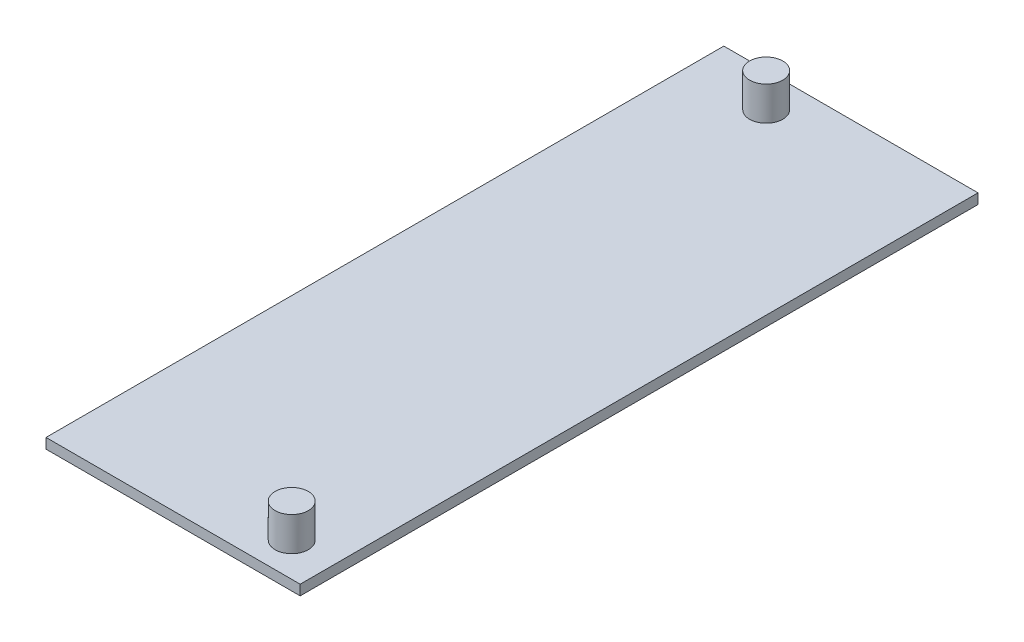
ISO-10303-21;
HEADER;
FILE_DESCRIPTION(('STEP AP214'),'2;1');
FILE_NAME('part.step','',(''),(''),'','','');
FILE_SCHEMA(('AUTOMOTIVE_DESIGN { 1 0 10303 214 1 1 1 1 }'));
ENDSEC;
DATA;
#1=APPLICATION_CONTEXT('core data for automotive mechanical design processes');
#2=APPLICATION_PROTOCOL_DEFINITION('international standard','automotive_design',2000,#1);
#3=PRODUCT_CONTEXT('',#1,'mechanical');
#4=PRODUCT('Part','Part','',(#3));
#5=PRODUCT_RELATED_PRODUCT_CATEGORY('part','',(#4));
#6=PRODUCT_DEFINITION_FORMATION('','',#4);
#7=PRODUCT_DEFINITION_CONTEXT('part definition',#1,'design');
#8=PRODUCT_DEFINITION('design','',#6,#7);
#9=PRODUCT_DEFINITION_SHAPE('','',#8);
#10=(LENGTH_UNIT() NAMED_UNIT(*) SI_UNIT(.MILLI.,.METRE.));
#11=(NAMED_UNIT(*) PLANE_ANGLE_UNIT() SI_UNIT($,.RADIAN.));
#12=(NAMED_UNIT(*) SI_UNIT($,.STERADIAN.) SOLID_ANGLE_UNIT());
#13=UNCERTAINTY_MEASURE_WITH_UNIT(LENGTH_MEASURE(1.E-05),#10,'distance_accuracy_value','');
#14=(GEOMETRIC_REPRESENTATION_CONTEXT(3) GLOBAL_UNCERTAINTY_ASSIGNED_CONTEXT((#13)) GLOBAL_UNIT_ASSIGNED_CONTEXT((#10,
#11,#12)) REPRESENTATION_CONTEXT('',''));
#15=CARTESIAN_POINT('',(0.,0.,0.));
#16=DIRECTION('',(0.,0.,1.));
#17=DIRECTION('',(1.,0.,0.));
#18=AXIS2_PLACEMENT_3D('',#15,#16,#17);
#19=CARTESIAN_POINT('',(0.,0.,200.));
#20=DIRECTION('',(1.,0.,0.));
#21=DIRECTION('',(0.,0.,-1.));
#22=AXIS2_PLACEMENT_3D('',#19,#20,#21);
#23=PLANE('',#22);
#24=DIRECTION('',(0.,-1.,0.));
#25=VECTOR('',#24,1.);
#26=CARTESIAN_POINT('',(0.,0.,0.));
#27=LINE('',#26,#25);
#28=CARTESIAN_POINT('',(0.,3.,0.));
#29=VERTEX_POINT('',#28);
#30=CARTESIAN_POINT('',(0.,0.,0.));
#31=VERTEX_POINT('',#30);
#32=EDGE_CURVE('E307',#29,#31,#27,.T.);
#33=ORIENTED_EDGE('',*,*,#32,.T.);
#34=DIRECTION('',(0.,0.,-1.));
#35=VECTOR('',#34,1.);
#36=CARTESIAN_POINT('',(0.,0.,200.));
#37=LINE('',#36,#35);
#38=CARTESIAN_POINT('',(0.,0.,200.));
#39=VERTEX_POINT('',#38);
#40=EDGE_CURVE('E336',#39,#31,#37,.T.);
#41=ORIENTED_EDGE('',*,*,#40,.F.);
#42=DIRECTION('',(0.,-1.,0.));
#43=VECTOR('',#42,1.);
#44=CARTESIAN_POINT('',(0.,0.,200.));
#45=LINE('',#44,#43);
#46=CARTESIAN_POINT('',(0.,3.,200.));
#47=VERTEX_POINT('',#46);
#48=EDGE_CURVE('E308',#47,#39,#45,.T.);
#49=ORIENTED_EDGE('',*,*,#48,.F.);
#50=DIRECTION('',(0.,0.,-1.));
#51=VECTOR('',#50,1.);
#52=CARTESIAN_POINT('',(0.,3.,200.));
#53=LINE('',#52,#51);
#54=EDGE_CURVE('E318',#47,#29,#53,.T.);
#55=ORIENTED_EDGE('',*,*,#54,.T.);
#56=EDGE_LOOP('',(#33,#41,#49,#55));
#57=FACE_BOUND('',#56,.T.);
#58=ADVANCED_FACE('F37',(#57),#23,.F.);
#59=CARTESIAN_POINT('',(0.,0.,200.));
#60=DIRECTION('',(0.,1.,0.));
#61=DIRECTION('',(0.,0.,1.));
#62=AXIS2_PLACEMENT_3D('',#59,#60,#61);
#63=PLANE('',#62);
#64=DIRECTION('',(1.,0.,0.));
#65=VECTOR('',#64,1.);
#66=CARTESIAN_POINT('',(45.,0.,150.));
#67=LINE('',#66,#65);
#68=CARTESIAN_POINT('',(45.,0.,150.));
#69=VERTEX_POINT('',#68);
#70=CARTESIAN_POINT('',(50.,0.,150.));
#71=VERTEX_POINT('',#70);
#72=EDGE_CURVE('E202',#69,#71,#67,.T.);
#73=ORIENTED_EDGE('',*,*,#72,.F.);
#74=DIRECTION('',(0.,0.,-1.));
#75=VECTOR('',#74,1.);
#76=CARTESIAN_POINT('',(45.,0.,180.));
#77=LINE('',#76,#75);
#78=CARTESIAN_POINT('',(45.,0.,180.));
#79=VERTEX_POINT('',#78);
#80=EDGE_CURVE('E51',#79,#69,#77,.T.);
#81=ORIENTED_EDGE('',*,*,#80,.F.);
#82=DIRECTION('',(-1.,0.,0.));
#83=VECTOR('',#82,1.);
#84=CARTESIAN_POINT('',(45.,0.,180.));
#85=LINE('',#84,#83);
#86=CARTESIAN_POINT('',(50.,0.,180.));
#87=VERTEX_POINT('',#86);
#88=EDGE_CURVE('E193',#87,#79,#85,.T.);
#89=ORIENTED_EDGE('',*,*,#88,.F.);
#90=DIRECTION('',(0.,0.,1.));
#91=VECTOR('',#90,1.);
#92=CARTESIAN_POINT('',(50.,0.,180.));
#93=LINE('',#92,#91);
#94=EDGE_CURVE('E196',#71,#87,#93,.T.);
#95=ORIENTED_EDGE('',*,*,#94,.F.);
#96=EDGE_LOOP('',(#73,#81,#89,#95));
#97=FACE_BOUND('',#96,.T.);
#98=DIRECTION('',(1.,0.,0.));
#99=VECTOR('',#98,1.);
#100=CARTESIAN_POINT('',(45.0000000000005,0.,100.));
#101=LINE('',#100,#99);
#102=CARTESIAN_POINT('',(45.0000000000005,0.,100.));
#103=VERTEX_POINT('',#102);
#104=CARTESIAN_POINT('',(50.0000000000005,0.,100.));
#105=VERTEX_POINT('',#104);
#106=EDGE_CURVE('E228',#103,#105,#101,.T.);
#107=ORIENTED_EDGE('',*,*,#106,.F.);
#108=DIRECTION('',(0.,0.,-1.));
#109=VECTOR('',#108,1.);
#110=CARTESIAN_POINT('',(45.0000000000005,0.,130.));
#111=LINE('',#110,#109);
#112=CARTESIAN_POINT('',(45.0000000000005,0.,130.));
#113=VERTEX_POINT('',#112);
#114=EDGE_CURVE('E59',#113,#103,#111,.T.);
#115=ORIENTED_EDGE('',*,*,#114,.F.);
#116=DIRECTION('',(-1.,0.,0.));
#117=VECTOR('',#116,1.);
#118=CARTESIAN_POINT('',(45.0000000000005,0.,130.));
#119=LINE('',#118,#117);
#120=CARTESIAN_POINT('',(50.0000000000005,0.,130.));
#121=VERTEX_POINT('',#120);
#122=EDGE_CURVE('E217',#121,#113,#119,.T.);
#123=ORIENTED_EDGE('',*,*,#122,.F.);
#124=DIRECTION('',(0.,0.,1.));
#125=VECTOR('',#124,1.);
#126=CARTESIAN_POINT('',(50.0000000000005,0.,130.));
#127=LINE('',#126,#125);
#128=EDGE_CURVE('E232',#105,#121,#127,.T.);
#129=ORIENTED_EDGE('',*,*,#128,.F.);
#130=EDGE_LOOP('',(#107,#115,#123,#129));
#131=FACE_BOUND('',#130,.T.);
#132=DIRECTION('',(1.,0.,0.));
#133=VECTOR('',#132,1.);
#134=CARTESIAN_POINT('',(45.000000000001,0.,50.));
#135=LINE('',#134,#133);
#136=CARTESIAN_POINT('',(45.000000000001,0.,50.));
#137=VERTEX_POINT('',#136);
#138=CARTESIAN_POINT('',(50.0000000000011,0.,50.));
#139=VERTEX_POINT('',#138);
#140=EDGE_CURVE('E259',#137,#139,#135,.T.);
#141=ORIENTED_EDGE('',*,*,#140,.F.);
#142=DIRECTION('',(0.,0.,-1.));
#143=VECTOR('',#142,1.);
#144=CARTESIAN_POINT('',(45.000000000001,0.,80.));
#145=LINE('',#144,#143);
#146=CARTESIAN_POINT('',(45.000000000001,0.,80.));
#147=VERTEX_POINT('',#146);
#148=EDGE_CURVE('E257',#147,#137,#145,.T.);
#149=ORIENTED_EDGE('',*,*,#148,.F.);
#150=DIRECTION('',(-1.,0.,0.));
#151=VECTOR('',#150,1.);
#152=CARTESIAN_POINT('',(45.000000000001,0.,80.));
#153=LINE('',#152,#151);
#154=CARTESIAN_POINT('',(50.000000000001,0.,80.));
#155=VERTEX_POINT('',#154);
#156=EDGE_CURVE('E247',#155,#147,#153,.T.);
#157=ORIENTED_EDGE('',*,*,#156,.F.);
#158=DIRECTION('',(0.,0.,1.));
#159=VECTOR('',#158,1.);
#160=CARTESIAN_POINT('',(50.000000000001,0.,80.));
#161=LINE('',#160,#159);
#162=EDGE_CURVE('E263',#139,#155,#161,.T.);
#163=ORIENTED_EDGE('',*,*,#162,.F.);
#164=EDGE_LOOP('',(#141,#149,#157,#163));
#165=FACE_BOUND('',#164,.T.);
#166=DIRECTION('',(1.,0.,0.));
#167=VECTOR('',#166,1.);
#168=CARTESIAN_POINT('',(0.,0.,0.));
#169=LINE('',#168,#167);
#170=CARTESIAN_POINT('',(45.0000000000016,0.,0.));
#171=VERTEX_POINT('',#170);
#172=EDGE_CURVE('E322',#31,#171,#169,.T.);
#173=ORIENTED_EDGE('',*,*,#172,.T.);
#174=DIRECTION('',(0.,0.,-1.));
#175=VECTOR('',#174,1.);
#176=CARTESIAN_POINT('',(45.0000000000016,0.,30.));
#177=LINE('',#176,#175);
#178=CARTESIAN_POINT('',(45.0000000000016,0.,30.));
#179=VERTEX_POINT('',#178);
#180=EDGE_CURVE('E288',#179,#171,#177,.T.);
#181=ORIENTED_EDGE('',*,*,#180,.F.);
#182=DIRECTION('',(-1.,0.,0.));
#183=VECTOR('',#182,1.);
#184=CARTESIAN_POINT('',(45.0000000000016,0.,30.));
#185=LINE('',#184,#183);
#186=CARTESIAN_POINT('',(50.0000000000016,0.,30.));
#187=VERTEX_POINT('',#186);
#188=EDGE_CURVE('E278',#187,#179,#185,.T.);
#189=ORIENTED_EDGE('',*,*,#188,.F.);
#190=DIRECTION('',(0.,0.,1.));
#191=VECTOR('',#190,1.);
#192=CARTESIAN_POINT('',(50.0000000000016,0.,30.));
#193=LINE('',#192,#191);
#194=CARTESIAN_POINT('',(50.0000000000016,0.,0.));
#195=VERTEX_POINT('',#194);
#196=EDGE_CURVE('E290',#195,#187,#193,.T.);
#197=ORIENTED_EDGE('',*,*,#196,.F.);
#198=CARTESIAN_POINT('',(75.,0.,0.));
#199=VERTEX_POINT('',#198);
#200=EDGE_CURVE('E321',#195,#199,#169,.T.);
#201=ORIENTED_EDGE('',*,*,#200,.T.);
#202=DIRECTION('',(0.,0.,-1.));
#203=VECTOR('',#202,1.);
#204=CARTESIAN_POINT('',(75.,0.,200.));
#205=LINE('',#204,#203);
#206=CARTESIAN_POINT('',(75.,0.,200.));
#207=VERTEX_POINT('',#206);
#208=EDGE_CURVE('E333',#207,#199,#205,.T.);
#209=ORIENTED_EDGE('',*,*,#208,.F.);
#210=DIRECTION('',(1.,0.,0.));
#211=VECTOR('',#210,1.);
#212=CARTESIAN_POINT('',(0.,0.,200.));
#213=LINE('',#212,#211);
#214=EDGE_CURVE('E311',#39,#207,#213,.T.);
#215=ORIENTED_EDGE('',*,*,#214,.F.);
#216=ORIENTED_EDGE('',*,*,#40,.T.);
#217=EDGE_LOOP('',(#173,#181,#189,#197,#201,#209,#215,#216));
#218=FACE_BOUND('',#217,.T.);
#219=ADVANCED_FACE('F365',(#97,#131,#165,#218),#63,.F.);
#220=CARTESIAN_POINT('',(75.,0.,200.));
#221=DIRECTION('',(-1.,0.,0.));
#222=DIRECTION('',(0.,0.,1.));
#223=AXIS2_PLACEMENT_3D('',#220,#221,#222);
#224=PLANE('',#223);
#225=DIRECTION('',(0.,1.,0.));
#226=VECTOR('',#225,1.);
#227=CARTESIAN_POINT('',(75.,0.,0.));
#228=LINE('',#227,#226);
#229=CARTESIAN_POINT('',(75.,3.,0.));
#230=VERTEX_POINT('',#229);
#231=EDGE_CURVE('E325',#199,#230,#228,.T.);
#232=ORIENTED_EDGE('',*,*,#231,.T.);
#233=DIRECTION('',(0.,0.,-1.));
#234=VECTOR('',#233,1.);
#235=CARTESIAN_POINT('',(75.,3.,200.));
#236=LINE('',#235,#234);
#237=CARTESIAN_POINT('',(75.,3.,200.));
#238=VERTEX_POINT('',#237);
#239=EDGE_CURVE('E330',#238,#230,#236,.T.);
#240=ORIENTED_EDGE('',*,*,#239,.F.);
#241=DIRECTION('',(0.,1.,0.));
#242=VECTOR('',#241,1.);
#243=CARTESIAN_POINT('',(75.,0.,200.));
#244=LINE('',#243,#242);
#245=EDGE_CURVE('E314',#207,#238,#244,.T.);
#246=ORIENTED_EDGE('',*,*,#245,.F.);
#247=ORIENTED_EDGE('',*,*,#208,.T.);
#248=EDGE_LOOP('',(#232,#240,#246,#247));
#249=FACE_BOUND('',#248,.T.);
#250=ADVANCED_FACE('F347',(#249),#224,.F.);
#251=CARTESIAN_POINT('',(0.,3.,200.));
#252=DIRECTION('',(0.,-1.,0.));
#253=DIRECTION('',(0.,0.,-1.));
#254=AXIS2_PLACEMENT_3D('',#251,#252,#253);
#255=PLANE('',#254);
#256=CARTESIAN_POINT('',(22.5,3.,10.));
#257=DIRECTION('',(0.,-1.,0.));
#258=DIRECTION('',(0.,0.,-1.));
#259=AXIS2_PLACEMENT_3D('',#256,#257,#258);
#260=CIRCLE('',#259,4.9);
#261=CARTESIAN_POINT('',(22.5,3.,5.10000000000001));
#262=VERTEX_POINT('',#261);
#263=EDGE_CURVE('E11',#262,#262,#260,.F.);
#264=ORIENTED_EDGE('',*,*,#263,.F.);
#265=EDGE_LOOP('',(#264));
#266=FACE_BOUND('',#265,.T.);
#267=CARTESIAN_POINT('',(62.5,3.,190.));
#268=DIRECTION('',(0.,-1.,0.));
#269=DIRECTION('',(0.,0.,-1.));
#270=AXIS2_PLACEMENT_3D('',#267,#268,#269);
#271=CIRCLE('',#270,4.89999999999999);
#272=CARTESIAN_POINT('',(62.5,3.,185.1));
#273=VERTEX_POINT('',#272);
#274=EDGE_CURVE('E44',#273,#273,#271,.F.);
#275=ORIENTED_EDGE('',*,*,#274,.F.);
#276=EDGE_LOOP('',(#275));
#277=FACE_BOUND('',#276,.T.);
#278=DIRECTION('',(-1.,0.,0.));
#279=VECTOR('',#278,1.);
#280=CARTESIAN_POINT('',(0.,3.,0.));
#281=LINE('',#280,#279);
#282=EDGE_CURVE('E312',#230,#29,#281,.T.);
#283=ORIENTED_EDGE('',*,*,#282,.T.);
#284=ORIENTED_EDGE('',*,*,#54,.F.);
#285=DIRECTION('',(-1.,0.,0.));
#286=VECTOR('',#285,1.);
#287=CARTESIAN_POINT('',(0.,3.,200.));
#288=LINE('',#287,#286);
#289=EDGE_CURVE('E316',#238,#47,#288,.T.);
#290=ORIENTED_EDGE('',*,*,#289,.F.);
#291=ORIENTED_EDGE('',*,*,#239,.T.);
#292=EDGE_LOOP('',(#283,#284,#290,#291));
#293=FACE_BOUND('',#292,.T.);
#294=ADVANCED_FACE('F343',(#266,#277,#293),#255,.F.);
#295=CARTESIAN_POINT('',(0.,0.,200.));
#296=DIRECTION('',(0.,0.,-1.));
#297=DIRECTION('',(-1.,0.,0.));
#298=AXIS2_PLACEMENT_3D('',#295,#296,#297);
#299=PLANE('',#298);
#300=ORIENTED_EDGE('',*,*,#48,.T.);
#301=ORIENTED_EDGE('',*,*,#214,.T.);
#302=ORIENTED_EDGE('',*,*,#245,.T.);
#303=ORIENTED_EDGE('',*,*,#289,.T.);
#304=EDGE_LOOP('',(#300,#301,#302,#303));
#305=FACE_BOUND('',#304,.T.);
#306=ADVANCED_FACE('F346',(#305),#299,.F.);
#307=CARTESIAN_POINT('',(0.,0.,0.));
#308=DIRECTION('',(0.,0.,-1.));
#309=DIRECTION('',(-1.,0.,0.));
#310=AXIS2_PLACEMENT_3D('',#307,#308,#309);
#311=PLANE('',#310);
#312=DIRECTION('',(0.,-1.,0.));
#313=VECTOR('',#312,1.);
#314=CARTESIAN_POINT('',(45.0000000000016,1.,0.));
#315=LINE('',#314,#313);
#316=CARTESIAN_POINT('',(45.0000000000016,1.,0.));
#317=VERTEX_POINT('',#316);
#318=EDGE_CURVE('E287',#317,#171,#315,.T.);
#319=ORIENTED_EDGE('',*,*,#318,.T.);
#320=ORIENTED_EDGE('',*,*,#172,.F.);
#321=ORIENTED_EDGE('',*,*,#32,.F.);
#322=ORIENTED_EDGE('',*,*,#282,.F.);
#323=ORIENTED_EDGE('',*,*,#231,.F.);
#324=ORIENTED_EDGE('',*,*,#200,.F.);
#325=DIRECTION('',(0.,-1.,0.));
#326=VECTOR('',#325,1.);
#327=CARTESIAN_POINT('',(50.0000000000016,1.,0.));
#328=LINE('',#327,#326);
#329=CARTESIAN_POINT('',(50.0000000000016,1.,0.));
#330=VERTEX_POINT('',#329);
#331=EDGE_CURVE('E298',#330,#195,#328,.T.);
#332=ORIENTED_EDGE('',*,*,#331,.F.);
#333=DIRECTION('',(1.,0.,0.));
#334=VECTOR('',#333,1.);
#335=CARTESIAN_POINT('',(45.0000000000016,1.,0.));
#336=LINE('',#335,#334);
#337=EDGE_CURVE('E277',#317,#330,#336,.T.);
#338=ORIENTED_EDGE('',*,*,#337,.F.);
#339=EDGE_LOOP('',(#319,#320,#321,#322,#323,#324,#332,#338));
#340=FACE_BOUND('',#339,.T.);
#341=ADVANCED_FACE('F360',(#340),#311,.T.);
#342=CARTESIAN_POINT('',(62.5,13.,190.));
#343=DIRECTION('',(0.,-1.,0.));
#344=DIRECTION('',(0.,0.,-1.));
#345=AXIS2_PLACEMENT_3D('',#342,#343,#344);
#346=CYLINDRICAL_SURFACE('',#345,4.89999999999999);
#347=CARTESIAN_POINT('',(62.5,13.,190.));
#348=DIRECTION('',(0.,1.,0.));
#349=DIRECTION('',(0.,0.,1.));
#350=AXIS2_PLACEMENT_3D('',#347,#348,#349);
#351=CIRCLE('',#350,4.89999999999999);
#352=CARTESIAN_POINT('',(62.5,13.,194.9));
#353=VERTEX_POINT('',#352);
#354=EDGE_CURVE('E304',#353,#353,#351,.T.);
#355=ORIENTED_EDGE('',*,*,#354,.F.);
#356=EDGE_LOOP('',(#355));
#357=FACE_BOUND('',#356,.T.);
#358=ORIENTED_EDGE('',*,*,#274,.T.);
#359=EDGE_LOOP('',(#358));
#360=FACE_BOUND('',#359,.T.);
#361=ADVANCED_FACE('F341',(#357,#360),#346,.T.);
#362=CARTESIAN_POINT('',(0.,13.,0.));
#363=DIRECTION('',(0.,1.,0.));
#364=DIRECTION('',(0.,0.,1.));
#365=AXIS2_PLACEMENT_3D('',#362,#363,#364);
#366=PLANE('',#365);
#367=ORIENTED_EDGE('',*,*,#354,.T.);
#368=EDGE_LOOP('',(#367));
#369=FACE_BOUND('',#368,.T.);
#370=ADVANCED_FACE('F411',(#369),#366,.T.);
#371=CARTESIAN_POINT('',(22.5,13.,10.));
#372=DIRECTION('',(0.,-1.,0.));
#373=DIRECTION('',(0.,0.,-1.));
#374=AXIS2_PLACEMENT_3D('',#371,#372,#373);
#375=CYLINDRICAL_SURFACE('',#374,4.9);
#376=CARTESIAN_POINT('',(22.5,13.,10.));
#377=DIRECTION('',(0.,1.,0.));
#378=DIRECTION('',(0.,0.,1.));
#379=AXIS2_PLACEMENT_3D('',#376,#377,#378);
#380=CIRCLE('',#379,4.9);
#381=CARTESIAN_POINT('',(22.5,13.,14.9));
#382=VERTEX_POINT('',#381);
#383=EDGE_CURVE('E209',#382,#382,#380,.T.);
#384=ORIENTED_EDGE('',*,*,#383,.F.);
#385=EDGE_LOOP('',(#384));
#386=FACE_BOUND('',#385,.T.);
#387=ORIENTED_EDGE('',*,*,#263,.T.);
#388=EDGE_LOOP('',(#387));
#389=FACE_BOUND('',#388,.T.);
#390=ADVANCED_FACE('F415',(#386,#389),#375,.T.);
#391=CARTESIAN_POINT('',(22.5,13.,10.));
#392=DIRECTION('',(0.,1.,0.));
#393=DIRECTION('',(0.,0.,1.));
#394=AXIS2_PLACEMENT_3D('',#391,#392,#393);
#395=PLANE('',#394);
#396=ORIENTED_EDGE('',*,*,#383,.T.);
#397=EDGE_LOOP('',(#396));
#398=FACE_BOUND('',#397,.T.);
#399=ADVANCED_FACE('F391',(#398),#395,.T.);
#400=CARTESIAN_POINT('',(45.0000000000016,1.,30.));
#401=DIRECTION('',(-1.,0.,0.));
#402=DIRECTION('',(0.,0.,1.));
#403=AXIS2_PLACEMENT_3D('',#400,#401,#402);
#404=PLANE('',#403);
#405=ORIENTED_EDGE('',*,*,#180,.T.);
#406=ORIENTED_EDGE('',*,*,#318,.F.);
#407=DIRECTION('',(0.,0.,-1.));
#408=VECTOR('',#407,1.);
#409=CARTESIAN_POINT('',(45.0000000000016,1.,30.));
#410=LINE('',#409,#408);
#411=CARTESIAN_POINT('',(45.0000000000016,1.,30.));
#412=VERTEX_POINT('',#411);
#413=EDGE_CURVE('E275',#412,#317,#410,.T.);
#414=ORIENTED_EDGE('',*,*,#413,.F.);
#415=DIRECTION('',(0.,-1.,0.));
#416=VECTOR('',#415,1.);
#417=CARTESIAN_POINT('',(45.0000000000016,1.,30.));
#418=LINE('',#417,#416);
#419=EDGE_CURVE('E260',#412,#179,#418,.T.);
#420=ORIENTED_EDGE('',*,*,#419,.T.);
#421=EDGE_LOOP('',(#405,#406,#414,#420));
#422=FACE_BOUND('',#421,.T.);
#423=ADVANCED_FACE('F381',(#422),#404,.F.);
#424=CARTESIAN_POINT('',(45.0000000000016,1.,30.));
#425=DIRECTION('',(0.,0.,1.));
#426=DIRECTION('',(1.,0.,0.));
#427=AXIS2_PLACEMENT_3D('',#424,#425,#426);
#428=PLANE('',#427);
#429=ORIENTED_EDGE('',*,*,#188,.T.);
#430=ORIENTED_EDGE('',*,*,#419,.F.);
#431=DIRECTION('',(-1.,0.,0.));
#432=VECTOR('',#431,1.);
#433=CARTESIAN_POINT('',(45.0000000000016,1.,30.));
#434=LINE('',#433,#432);
#435=CARTESIAN_POINT('',(50.0000000000016,1.,30.));
#436=VERTEX_POINT('',#435);
#437=EDGE_CURVE('E284',#436,#412,#434,.T.);
#438=ORIENTED_EDGE('',*,*,#437,.F.);
#439=DIRECTION('',(0.,-1.,0.));
#440=VECTOR('',#439,1.);
#441=CARTESIAN_POINT('',(50.0000000000016,1.,30.));
#442=LINE('',#441,#440);
#443=EDGE_CURVE('E296',#436,#187,#442,.T.);
#444=ORIENTED_EDGE('',*,*,#443,.T.);
#445=EDGE_LOOP('',(#429,#430,#438,#444));
#446=FACE_BOUND('',#445,.T.);
#447=ADVANCED_FACE('F383',(#446),#428,.F.);
#448=CARTESIAN_POINT('',(50.0000000000016,1.,30.));
#449=DIRECTION('',(1.,0.,0.));
#450=DIRECTION('',(0.,0.,-1.));
#451=AXIS2_PLACEMENT_3D('',#448,#449,#450);
#452=PLANE('',#451);
#453=ORIENTED_EDGE('',*,*,#196,.T.);
#454=ORIENTED_EDGE('',*,*,#443,.F.);
#455=DIRECTION('',(0.,0.,1.));
#456=VECTOR('',#455,1.);
#457=CARTESIAN_POINT('',(50.0000000000016,1.,30.));
#458=LINE('',#457,#456);
#459=EDGE_CURVE('E281',#330,#436,#458,.T.);
#460=ORIENTED_EDGE('',*,*,#459,.F.);
#461=ORIENTED_EDGE('',*,*,#331,.T.);
#462=EDGE_LOOP('',(#453,#454,#460,#461));
#463=FACE_BOUND('',#462,.T.);
#464=ADVANCED_FACE('F375',(#463),#452,.F.);
#465=CARTESIAN_POINT('',(0.,1.,0.));
#466=DIRECTION('',(0.,-1.,0.));
#467=DIRECTION('',(0.,0.,-1.));
#468=AXIS2_PLACEMENT_3D('',#465,#466,#467);
#469=PLANE('',#468);
#470=ORIENTED_EDGE('',*,*,#413,.T.);
#471=ORIENTED_EDGE('',*,*,#337,.T.);
#472=ORIENTED_EDGE('',*,*,#459,.T.);
#473=ORIENTED_EDGE('',*,*,#437,.T.);
#474=EDGE_LOOP('',(#470,#471,#472,#473));
#475=FACE_BOUND('',#474,.T.);
#476=ADVANCED_FACE('F378',(#475),#469,.T.);
#477=CARTESIAN_POINT('',(45.000000000001,1.,80.));
#478=DIRECTION('',(-1.,0.,0.));
#479=DIRECTION('',(0.,0.,1.));
#480=AXIS2_PLACEMENT_3D('',#477,#478,#479);
#481=PLANE('',#480);
#482=ORIENTED_EDGE('',*,*,#148,.T.);
#483=DIRECTION('',(0.,-1.,0.));
#484=VECTOR('',#483,1.);
#485=CARTESIAN_POINT('',(45.000000000001,1.,50.));
#486=LINE('',#485,#484);
#487=CARTESIAN_POINT('',(45.000000000001,1.,50.));
#488=VERTEX_POINT('',#487);
#489=EDGE_CURVE('E256',#488,#137,#486,.T.);
#490=ORIENTED_EDGE('',*,*,#489,.F.);
#491=DIRECTION('',(0.,0.,-1.));
#492=VECTOR('',#491,1.);
#493=CARTESIAN_POINT('',(45.000000000001,1.,80.));
#494=LINE('',#493,#492);
#495=CARTESIAN_POINT('',(45.000000000001,1.,80.));
#496=VERTEX_POINT('',#495);
#497=EDGE_CURVE('E243',#496,#488,#494,.T.);
#498=ORIENTED_EDGE('',*,*,#497,.F.);
#499=DIRECTION('',(0.,-1.,0.));
#500=VECTOR('',#499,1.);
#501=CARTESIAN_POINT('',(45.000000000001,1.,80.));
#502=LINE('',#501,#500);
#503=EDGE_CURVE('E229',#496,#147,#502,.T.);
#504=ORIENTED_EDGE('',*,*,#503,.T.);
#505=EDGE_LOOP('',(#482,#490,#498,#504));
#506=FACE_BOUND('',#505,.T.);
#507=ADVANCED_FACE('F460',(#506),#481,.F.);
#508=CARTESIAN_POINT('',(45.000000000001,1.,80.));
#509=DIRECTION('',(0.,0.,1.));
#510=DIRECTION('',(1.,0.,0.));
#511=AXIS2_PLACEMENT_3D('',#508,#509,#510);
#512=PLANE('',#511);
#513=ORIENTED_EDGE('',*,*,#156,.T.);
#514=ORIENTED_EDGE('',*,*,#503,.F.);
#515=DIRECTION('',(-1.,0.,0.));
#516=VECTOR('',#515,1.);
#517=CARTESIAN_POINT('',(45.000000000001,1.,80.));
#518=LINE('',#517,#516);
#519=CARTESIAN_POINT('',(50.000000000001,1.,80.));
#520=VERTEX_POINT('',#519);
#521=EDGE_CURVE('E253',#520,#496,#518,.T.);
#522=ORIENTED_EDGE('',*,*,#521,.F.);
#523=DIRECTION('',(0.,-1.,0.));
#524=VECTOR('',#523,1.);
#525=CARTESIAN_POINT('',(50.000000000001,1.,80.));
#526=LINE('',#525,#524);
#527=EDGE_CURVE('E269',#520,#155,#526,.T.);
#528=ORIENTED_EDGE('',*,*,#527,.T.);
#529=EDGE_LOOP('',(#513,#514,#522,#528));
#530=FACE_BOUND('',#529,.T.);
#531=ADVANCED_FACE('F468',(#530),#512,.F.);
#532=CARTESIAN_POINT('',(50.000000000001,1.,80.));
#533=DIRECTION('',(1.,0.,0.));
#534=DIRECTION('',(0.,0.,-1.));
#535=AXIS2_PLACEMENT_3D('',#532,#533,#534);
#536=PLANE('',#535);
#537=ORIENTED_EDGE('',*,*,#162,.T.);
#538=ORIENTED_EDGE('',*,*,#527,.F.);
#539=DIRECTION('',(0.,0.,1.));
#540=VECTOR('',#539,1.);
#541=CARTESIAN_POINT('',(50.000000000001,1.,80.));
#542=LINE('',#541,#540);
#543=CARTESIAN_POINT('',(50.0000000000011,1.,50.));
#544=VERTEX_POINT('',#543);
#545=EDGE_CURVE('E250',#544,#520,#542,.T.);
#546=ORIENTED_EDGE('',*,*,#545,.F.);
#547=DIRECTION('',(0.,-1.,0.));
#548=VECTOR('',#547,1.);
#549=CARTESIAN_POINT('',(50.0000000000011,1.,50.));
#550=LINE('',#549,#548);
#551=EDGE_CURVE('E271',#544,#139,#550,.T.);
#552=ORIENTED_EDGE('',*,*,#551,.T.);
#553=EDGE_LOOP('',(#537,#538,#546,#552));
#554=FACE_BOUND('',#553,.T.);
#555=ADVANCED_FACE('F478',(#554),#536,.F.);
#556=CARTESIAN_POINT('',(45.000000000001,1.,50.));
#557=DIRECTION('',(0.,0.,-1.));
#558=DIRECTION('',(-1.,0.,0.));
#559=AXIS2_PLACEMENT_3D('',#556,#557,#558);
#560=PLANE('',#559);
#561=ORIENTED_EDGE('',*,*,#140,.T.);
#562=ORIENTED_EDGE('',*,*,#551,.F.);
#563=DIRECTION('',(1.,0.,0.));
#564=VECTOR('',#563,1.);
#565=CARTESIAN_POINT('',(45.000000000001,1.,50.));
#566=LINE('',#565,#564);
#567=EDGE_CURVE('E246',#488,#544,#566,.T.);
#568=ORIENTED_EDGE('',*,*,#567,.F.);
#569=ORIENTED_EDGE('',*,*,#489,.T.);
#570=EDGE_LOOP('',(#561,#562,#568,#569));
#571=FACE_BOUND('',#570,.T.);
#572=ADVANCED_FACE('F488',(#571),#560,.F.);
#573=CARTESIAN_POINT('',(0.,1.,0.));
#574=DIRECTION('',(0.,-1.,0.));
#575=DIRECTION('',(0.,0.,-1.));
#576=AXIS2_PLACEMENT_3D('',#573,#574,#575);
#577=PLANE('',#576);
#578=ORIENTED_EDGE('',*,*,#497,.T.);
#579=ORIENTED_EDGE('',*,*,#567,.T.);
#580=ORIENTED_EDGE('',*,*,#545,.T.);
#581=ORIENTED_EDGE('',*,*,#521,.T.);
#582=EDGE_LOOP('',(#578,#579,#580,#581));
#583=FACE_BOUND('',#582,.T.);
#584=ADVANCED_FACE('F498',(#583),#577,.T.);
#585=CARTESIAN_POINT('',(45.0000000000005,1.,130.));
#586=DIRECTION('',(-1.,0.,0.));
#587=DIRECTION('',(0.,0.,1.));
#588=AXIS2_PLACEMENT_3D('',#585,#586,#587);
#589=PLANE('',#588);
#590=ORIENTED_EDGE('',*,*,#114,.T.);
#591=DIRECTION('',(0.,-1.,0.));
#592=VECTOR('',#591,1.);
#593=CARTESIAN_POINT('',(45.0000000000005,1.,100.));
#594=LINE('',#593,#592);
#595=CARTESIAN_POINT('',(45.0000000000005,1.,100.));
#596=VERTEX_POINT('',#595);
#597=EDGE_CURVE('E226',#596,#103,#594,.T.);
#598=ORIENTED_EDGE('',*,*,#597,.F.);
#599=DIRECTION('',(0.,0.,-1.));
#600=VECTOR('',#599,1.);
#601=CARTESIAN_POINT('',(45.0000000000005,1.,130.));
#602=LINE('',#601,#600);
#603=CARTESIAN_POINT('',(45.0000000000005,1.,130.));
#604=VERTEX_POINT('',#603);
#605=EDGE_CURVE('E213',#604,#596,#602,.T.);
#606=ORIENTED_EDGE('',*,*,#605,.F.);
#607=DIRECTION('',(0.,-1.,0.));
#608=VECTOR('',#607,1.);
#609=CARTESIAN_POINT('',(45.0000000000005,1.,130.));
#610=LINE('',#609,#608);
#611=EDGE_CURVE('E203',#604,#113,#610,.T.);
#612=ORIENTED_EDGE('',*,*,#611,.T.);
#613=EDGE_LOOP('',(#590,#598,#606,#612));
#614=FACE_BOUND('',#613,.T.);
#615=ADVANCED_FACE('F508',(#614),#589,.F.);
#616=CARTESIAN_POINT('',(45.0000000000005,1.,130.));
#617=DIRECTION('',(0.,0.,1.));
#618=DIRECTION('',(1.,0.,0.));
#619=AXIS2_PLACEMENT_3D('',#616,#617,#618);
#620=PLANE('',#619);
#621=ORIENTED_EDGE('',*,*,#122,.T.);
#622=ORIENTED_EDGE('',*,*,#611,.F.);
#623=DIRECTION('',(-1.,0.,0.));
#624=VECTOR('',#623,1.);
#625=CARTESIAN_POINT('',(45.0000000000005,1.,130.));
#626=LINE('',#625,#624);
#627=CARTESIAN_POINT('',(50.0000000000005,1.,130.));
#628=VERTEX_POINT('',#627);
#629=EDGE_CURVE('E223',#628,#604,#626,.T.);
#630=ORIENTED_EDGE('',*,*,#629,.F.);
#631=DIRECTION('',(0.,-1.,0.));
#632=VECTOR('',#631,1.);
#633=CARTESIAN_POINT('',(50.0000000000005,1.,130.));
#634=LINE('',#633,#632);
#635=EDGE_CURVE('E238',#628,#121,#634,.T.);
#636=ORIENTED_EDGE('',*,*,#635,.T.);
#637=EDGE_LOOP('',(#621,#622,#630,#636));
#638=FACE_BOUND('',#637,.T.);
#639=ADVANCED_FACE('F518',(#638),#620,.F.);
#640=CARTESIAN_POINT('',(50.0000000000005,1.,130.));
#641=DIRECTION('',(1.,0.,0.));
#642=DIRECTION('',(0.,0.,-1.));
#643=AXIS2_PLACEMENT_3D('',#640,#641,#642);
#644=PLANE('',#643);
#645=ORIENTED_EDGE('',*,*,#128,.T.);
#646=ORIENTED_EDGE('',*,*,#635,.F.);
#647=DIRECTION('',(0.,0.,1.));
#648=VECTOR('',#647,1.);
#649=CARTESIAN_POINT('',(50.0000000000005,1.,130.));
#650=LINE('',#649,#648);
#651=CARTESIAN_POINT('',(50.0000000000005,1.,100.));
#652=VERTEX_POINT('',#651);
#653=EDGE_CURVE('E220',#652,#628,#650,.T.);
#654=ORIENTED_EDGE('',*,*,#653,.F.);
#655=DIRECTION('',(0.,-1.,0.));
#656=VECTOR('',#655,1.);
#657=CARTESIAN_POINT('',(50.0000000000005,1.,100.));
#658=LINE('',#657,#656);
#659=EDGE_CURVE('E240',#652,#105,#658,.T.);
#660=ORIENTED_EDGE('',*,*,#659,.T.);
#661=EDGE_LOOP('',(#645,#646,#654,#660));
#662=FACE_BOUND('',#661,.T.);
#663=ADVANCED_FACE('F527',(#662),#644,.F.);
#664=CARTESIAN_POINT('',(45.0000000000005,1.,100.));
#665=DIRECTION('',(0.,0.,-1.));
#666=DIRECTION('',(-1.,0.,0.));
#667=AXIS2_PLACEMENT_3D('',#664,#665,#666);
#668=PLANE('',#667);
#669=ORIENTED_EDGE('',*,*,#106,.T.);
#670=ORIENTED_EDGE('',*,*,#659,.F.);
#671=DIRECTION('',(1.,0.,0.));
#672=VECTOR('',#671,1.);
#673=CARTESIAN_POINT('',(45.0000000000005,1.,100.));
#674=LINE('',#673,#672);
#675=EDGE_CURVE('E216',#596,#652,#674,.T.);
#676=ORIENTED_EDGE('',*,*,#675,.F.);
#677=ORIENTED_EDGE('',*,*,#597,.T.);
#678=EDGE_LOOP('',(#669,#670,#676,#677));
#679=FACE_BOUND('',#678,.T.);
#680=ADVANCED_FACE('F537',(#679),#668,.F.);
#681=CARTESIAN_POINT('',(0.,1.,0.));
#682=DIRECTION('',(0.,-1.,0.));
#683=DIRECTION('',(0.,0.,-1.));
#684=AXIS2_PLACEMENT_3D('',#681,#682,#683);
#685=PLANE('',#684);
#686=ORIENTED_EDGE('',*,*,#605,.T.);
#687=ORIENTED_EDGE('',*,*,#675,.T.);
#688=ORIENTED_EDGE('',*,*,#653,.T.);
#689=ORIENTED_EDGE('',*,*,#629,.T.);
#690=EDGE_LOOP('',(#686,#687,#688,#689));
#691=FACE_BOUND('',#690,.T.);
#692=ADVANCED_FACE('F547',(#691),#685,.T.);
#693=CARTESIAN_POINT('',(45.,1.,180.));
#694=DIRECTION('',(-1.,0.,0.));
#695=DIRECTION('',(0.,0.,1.));
#696=AXIS2_PLACEMENT_3D('',#693,#694,#695);
#697=PLANE('',#696);
#698=ORIENTED_EDGE('',*,*,#80,.T.);
#699=DIRECTION('',(0.,-1.,0.));
#700=VECTOR('',#699,1.);
#701=CARTESIAN_POINT('',(45.,1.,150.));
#702=LINE('',#701,#700);
#703=CARTESIAN_POINT('',(45.,1.,150.));
#704=VERTEX_POINT('',#703);
#705=EDGE_CURVE('E171',#704,#69,#702,.T.);
#706=ORIENTED_EDGE('',*,*,#705,.F.);
#707=DIRECTION('',(0.,0.,-1.));
#708=VECTOR('',#707,1.);
#709=CARTESIAN_POINT('',(45.,1.,180.));
#710=LINE('',#709,#708);
#711=CARTESIAN_POINT('',(45.,1.,180.));
#712=VERTEX_POINT('',#711);
#713=EDGE_CURVE('E175',#712,#704,#710,.T.);
#714=ORIENTED_EDGE('',*,*,#713,.F.);
#715=DIRECTION('',(0.,-1.,0.));
#716=VECTOR('',#715,1.);
#717=CARTESIAN_POINT('',(45.,1.,180.));
#718=LINE('',#717,#716);
#719=EDGE_CURVE('E207',#712,#79,#718,.T.);
#720=ORIENTED_EDGE('',*,*,#719,.T.);
#721=EDGE_LOOP('',(#698,#706,#714,#720));
#722=FACE_BOUND('',#721,.T.);
#723=ADVANCED_FACE('F173',(#722),#697,.F.);
#724=CARTESIAN_POINT('',(45.,1.,180.));
#725=DIRECTION('',(0.,0.,1.));
#726=DIRECTION('',(1.,0.,0.));
#727=AXIS2_PLACEMENT_3D('',#724,#725,#726);
#728=PLANE('',#727);
#729=ORIENTED_EDGE('',*,*,#88,.T.);
#730=ORIENTED_EDGE('',*,*,#719,.F.);
#731=DIRECTION('',(-1.,0.,0.));
#732=VECTOR('',#731,1.);
#733=CARTESIAN_POINT('',(45.,1.,180.));
#734=LINE('',#733,#732);
#735=CARTESIAN_POINT('',(50.,1.,180.));
#736=VERTEX_POINT('',#735);
#737=EDGE_CURVE('E181',#736,#712,#734,.T.);
#738=ORIENTED_EDGE('',*,*,#737,.F.);
#739=DIRECTION('',(0.,-1.,0.));
#740=VECTOR('',#739,1.);
#741=CARTESIAN_POINT('',(50.,1.,180.));
#742=LINE('',#741,#740);
#743=EDGE_CURVE('E210',#736,#87,#742,.T.);
#744=ORIENTED_EDGE('',*,*,#743,.T.);
#745=EDGE_LOOP('',(#729,#730,#738,#744));
#746=FACE_BOUND('',#745,.T.);
#747=ADVANCED_FACE('F566',(#746),#728,.F.);
#748=CARTESIAN_POINT('',(50.,1.,180.));
#749=DIRECTION('',(1.,0.,0.));
#750=DIRECTION('',(0.,0.,-1.));
#751=AXIS2_PLACEMENT_3D('',#748,#749,#750);
#752=PLANE('',#751);
#753=ORIENTED_EDGE('',*,*,#94,.T.);
#754=ORIENTED_EDGE('',*,*,#743,.F.);
#755=DIRECTION('',(0.,0.,1.));
#756=VECTOR('',#755,1.);
#757=CARTESIAN_POINT('',(50.,1.,180.));
#758=LINE('',#757,#756);
#759=CARTESIAN_POINT('',(50.,1.,150.));
#760=VERTEX_POINT('',#759);
#761=EDGE_CURVE('E189',#760,#736,#758,.T.);
#762=ORIENTED_EDGE('',*,*,#761,.F.);
#763=DIRECTION('',(0.,-1.,0.));
#764=VECTOR('',#763,1.);
#765=CARTESIAN_POINT('',(50.,1.,150.));
#766=LINE('',#765,#764);
#767=EDGE_CURVE('E180',#760,#71,#766,.T.);
#768=ORIENTED_EDGE('',*,*,#767,.T.);
#769=EDGE_LOOP('',(#753,#754,#762,#768));
#770=FACE_BOUND('',#769,.T.);
#771=ADVANCED_FACE('F575',(#770),#752,.F.);
#772=CARTESIAN_POINT('',(45.,1.,150.));
#773=DIRECTION('',(0.,0.,-1.));
#774=DIRECTION('',(-1.,0.,0.));
#775=AXIS2_PLACEMENT_3D('',#772,#773,#774);
#776=PLANE('',#775);
#777=ORIENTED_EDGE('',*,*,#72,.T.);
#778=ORIENTED_EDGE('',*,*,#767,.F.);
#779=DIRECTION('',(1.,0.,0.));
#780=VECTOR('',#779,1.);
#781=CARTESIAN_POINT('',(45.,1.,150.));
#782=LINE('',#781,#780);
#783=EDGE_CURVE('E184',#704,#760,#782,.T.);
#784=ORIENTED_EDGE('',*,*,#783,.F.);
#785=ORIENTED_EDGE('',*,*,#705,.T.);
#786=EDGE_LOOP('',(#777,#778,#784,#785));
#787=FACE_BOUND('',#786,.T.);
#788=ADVANCED_FACE('F185',(#787),#776,.F.);
#789=CARTESIAN_POINT('',(0.,1.,0.));
#790=DIRECTION('',(0.,-1.,0.));
#791=DIRECTION('',(0.,0.,-1.));
#792=AXIS2_PLACEMENT_3D('',#789,#790,#791);
#793=PLANE('',#792);
#794=ORIENTED_EDGE('',*,*,#713,.T.);
#795=ORIENTED_EDGE('',*,*,#783,.T.);
#796=ORIENTED_EDGE('',*,*,#761,.T.);
#797=ORIENTED_EDGE('',*,*,#737,.T.);
#798=EDGE_LOOP('',(#794,#795,#796,#797));
#799=FACE_BOUND('',#798,.T.);
#800=ADVANCED_FACE('F191',(#799),#793,.T.);
#801=CLOSED_SHELL('',(#58,#219,#250,#294,#306,#341,#361,#370,#390,#399,#423,#447,#464,#476,#507,
#531,#555,#572,#584,#615,#639,#663,#680,#692,#723,#747,#771,#788,#800));
#802=MANIFOLD_SOLID_BREP('B2',#801);
#803=ADVANCED_BREP_SHAPE_REPRESENTATION('',(#18,#802),#14);
#804=SHAPE_DEFINITION_REPRESENTATION(#9,#803);
ENDSEC;
END-ISO-10303-21;
